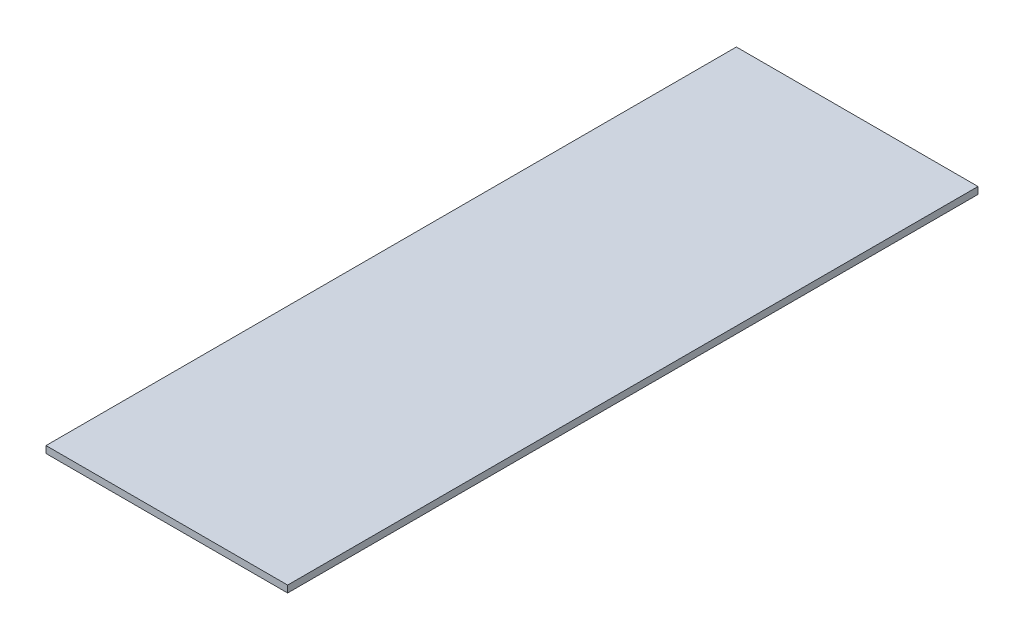
ISO-10303-21;
HEADER;
FILE_DESCRIPTION(('STEP AP214'),'2;1');
FILE_NAME('part.step','',(''),(''),'','','');
FILE_SCHEMA(('AUTOMOTIVE_DESIGN { 1 0 10303 214 1 1 1 1 }'));
ENDSEC;
DATA;
#1=APPLICATION_CONTEXT('core data for automotive mechanical design processes');
#2=APPLICATION_PROTOCOL_DEFINITION('international standard','automotive_design',2000,#1);
#3=PRODUCT_CONTEXT('',#1,'mechanical');
#4=PRODUCT('Part','Part','',(#3));
#5=PRODUCT_RELATED_PRODUCT_CATEGORY('part','',(#4));
#6=PRODUCT_DEFINITION_FORMATION('','',#4);
#7=PRODUCT_DEFINITION_CONTEXT('part definition',#1,'design');
#8=PRODUCT_DEFINITION('design','',#6,#7);
#9=PRODUCT_DEFINITION_SHAPE('','',#8);
#10=(LENGTH_UNIT() NAMED_UNIT(*) SI_UNIT(.MILLI.,.METRE.));
#11=(NAMED_UNIT(*) PLANE_ANGLE_UNIT() SI_UNIT($,.RADIAN.));
#12=(NAMED_UNIT(*) SI_UNIT($,.STERADIAN.) SOLID_ANGLE_UNIT());
#13=UNCERTAINTY_MEASURE_WITH_UNIT(LENGTH_MEASURE(1.E-05),#10,'distance_accuracy_value','');
#14=(GEOMETRIC_REPRESENTATION_CONTEXT(3) GLOBAL_UNCERTAINTY_ASSIGNED_CONTEXT((#13)) GLOBAL_UNIT_ASSIGNED_CONTEXT((#10,
#11,#12)) REPRESENTATION_CONTEXT('',''));
#15=CARTESIAN_POINT('',(0.,0.,0.));
#16=DIRECTION('',(0.,0.,1.));
#17=DIRECTION('',(1.,0.,0.));
#18=AXIS2_PLACEMENT_3D('',#15,#16,#17);
#19=CARTESIAN_POINT('',(-193.288590604027,2.,-91.9463087248322));
#20=DIRECTION('',(1.,0.,0.));
#21=DIRECTION('',(0.,0.,-1.));
#22=AXIS2_PLACEMENT_3D('',#19,#20,#21);
#23=PLANE('',#22);
#24=DIRECTION('',(0.,0.,1.));
#25=VECTOR('',#24,1.);
#26=CARTESIAN_POINT('',(-193.288590604027,0.,-91.9463087248322));
#27=LINE('',#26,#25);
#28=CARTESIAN_POINT('',(-193.288590604027,0.,-91.9463087248322));
#29=VERTEX_POINT('',#28);
#30=CARTESIAN_POINT('',(-193.288590604027,0.,108.053691275168));
#31=VERTEX_POINT('',#30);
#32=EDGE_CURVE('E105',#29,#31,#27,.T.);
#33=ORIENTED_EDGE('',*,*,#32,.T.);
#34=DIRECTION('',(0.,-1.,0.));
#35=VECTOR('',#34,1.);
#36=CARTESIAN_POINT('',(-193.288590604027,2.,108.053691275168));
#37=LINE('',#36,#35);
#38=CARTESIAN_POINT('',(-193.288590604027,2.,108.053691275168));
#39=VERTEX_POINT('',#38);
#40=EDGE_CURVE('E11',#39,#31,#37,.T.);
#41=ORIENTED_EDGE('',*,*,#40,.F.);
#42=DIRECTION('',(0.,0.,1.));
#43=VECTOR('',#42,1.);
#44=CARTESIAN_POINT('',(-193.288590604027,2.,-91.9463087248322));
#45=LINE('',#44,#43);
#46=CARTESIAN_POINT('',(-193.288590604027,2.,-91.9463087248322));
#47=VERTEX_POINT('',#46);
#48=EDGE_CURVE('E89',#47,#39,#45,.T.);
#49=ORIENTED_EDGE('',*,*,#48,.F.);
#50=DIRECTION('',(0.,-1.,0.));
#51=VECTOR('',#50,1.);
#52=CARTESIAN_POINT('',(-193.288590604027,2.,-91.9463087248322));
#53=LINE('',#52,#51);
#54=EDGE_CURVE('E101',#47,#29,#53,.T.);
#55=ORIENTED_EDGE('',*,*,#54,.T.);
#56=EDGE_LOOP('',(#33,#41,#49,#55));
#57=FACE_BOUND('',#56,.T.);
#58=ADVANCED_FACE('F37',(#57),#23,.F.);
#59=CARTESIAN_POINT('',(-193.288590604027,2.,108.053691275168));
#60=DIRECTION('',(0.,0.,-1.));
#61=DIRECTION('',(-1.,0.,0.));
#62=AXIS2_PLACEMENT_3D('',#59,#60,#61);
#63=PLANE('',#62);
#64=DIRECTION('',(1.,0.,0.));
#65=VECTOR('',#64,1.);
#66=CARTESIAN_POINT('',(-193.288590604027,0.,108.053691275168));
#67=LINE('',#66,#65);
#68=CARTESIAN_POINT('',(-123.288590604027,0.,108.053691275168));
#69=VERTEX_POINT('',#68);
#70=EDGE_CURVE('E94',#31,#69,#67,.T.);
#71=ORIENTED_EDGE('',*,*,#70,.T.);
#72=DIRECTION('',(0.,-1.,0.));
#73=VECTOR('',#72,1.);
#74=CARTESIAN_POINT('',(-123.288590604027,2.,108.053691275168));
#75=LINE('',#74,#73);
#76=CARTESIAN_POINT('',(-123.288590604027,2.,108.053691275168));
#77=VERTEX_POINT('',#76);
#78=EDGE_CURVE('E46',#77,#69,#75,.T.);
#79=ORIENTED_EDGE('',*,*,#78,.F.);
#80=DIRECTION('',(1.,0.,0.));
#81=VECTOR('',#80,1.);
#82=CARTESIAN_POINT('',(-193.288590604027,2.,108.053691275168));
#83=LINE('',#82,#81);
#84=EDGE_CURVE('E84',#39,#77,#83,.T.);
#85=ORIENTED_EDGE('',*,*,#84,.F.);
#86=ORIENTED_EDGE('',*,*,#40,.T.);
#87=EDGE_LOOP('',(#71,#79,#85,#86));
#88=FACE_BOUND('',#87,.T.);
#89=ADVANCED_FACE('F93',(#88),#63,.F.);
#90=CARTESIAN_POINT('',(-123.288590604027,2.,-91.9463087248322));
#91=DIRECTION('',(-1.,0.,0.));
#92=DIRECTION('',(0.,0.,1.));
#93=AXIS2_PLACEMENT_3D('',#90,#91,#92);
#94=PLANE('',#93);
#95=DIRECTION('',(0.,0.,-1.));
#96=VECTOR('',#95,1.);
#97=CARTESIAN_POINT('',(-123.288590604027,0.,-91.9463087248322));
#98=LINE('',#97,#96);
#99=CARTESIAN_POINT('',(-123.288590604027,0.,-91.9463087248322));
#100=VERTEX_POINT('',#99);
#101=EDGE_CURVE('E71',#69,#100,#98,.T.);
#102=ORIENTED_EDGE('',*,*,#101,.T.);
#103=DIRECTION('',(0.,-1.,0.));
#104=VECTOR('',#103,1.);
#105=CARTESIAN_POINT('',(-123.288590604027,2.,-91.9463087248322));
#106=LINE('',#105,#104);
#107=CARTESIAN_POINT('',(-123.288590604027,2.,-91.9463087248322));
#108=VERTEX_POINT('',#107);
#109=EDGE_CURVE('E96',#108,#100,#106,.T.);
#110=ORIENTED_EDGE('',*,*,#109,.F.);
#111=DIRECTION('',(0.,0.,-1.));
#112=VECTOR('',#111,1.);
#113=CARTESIAN_POINT('',(-123.288590604027,2.,-91.9463087248322));
#114=LINE('',#113,#112);
#115=EDGE_CURVE('E87',#77,#108,#114,.T.);
#116=ORIENTED_EDGE('',*,*,#115,.F.);
#117=ORIENTED_EDGE('',*,*,#78,.T.);
#118=EDGE_LOOP('',(#102,#110,#116,#117));
#119=FACE_BOUND('',#118,.T.);
#120=ADVANCED_FACE('F97',(#119),#94,.F.);
#121=CARTESIAN_POINT('',(-193.288590604027,2.,-91.9463087248322));
#122=DIRECTION('',(0.,0.,1.));
#123=DIRECTION('',(1.,0.,0.));
#124=AXIS2_PLACEMENT_3D('',#121,#122,#123);
#125=PLANE('',#124);
#126=DIRECTION('',(-1.,0.,0.));
#127=VECTOR('',#126,1.);
#128=CARTESIAN_POINT('',(-193.288590604027,0.,-91.9463087248322));
#129=LINE('',#128,#127);
#130=EDGE_CURVE('E77',#100,#29,#129,.T.);
#131=ORIENTED_EDGE('',*,*,#130,.T.);
#132=ORIENTED_EDGE('',*,*,#54,.F.);
#133=DIRECTION('',(-1.,0.,0.));
#134=VECTOR('',#133,1.);
#135=CARTESIAN_POINT('',(-193.288590604027,2.,-91.9463087248322));
#136=LINE('',#135,#134);
#137=EDGE_CURVE('E54',#108,#47,#136,.T.);
#138=ORIENTED_EDGE('',*,*,#137,.F.);
#139=ORIENTED_EDGE('',*,*,#109,.T.);
#140=EDGE_LOOP('',(#131,#132,#138,#139));
#141=FACE_BOUND('',#140,.T.);
#142=ADVANCED_FACE('F118',(#141),#125,.F.);
#143=CARTESIAN_POINT('',(0.,2.,0.));
#144=DIRECTION('',(0.,1.,0.));
#145=DIRECTION('',(0.,0.,1.));
#146=AXIS2_PLACEMENT_3D('',#143,#144,#145);
#147=PLANE('',#146);
#148=ORIENTED_EDGE('',*,*,#48,.T.);
#149=ORIENTED_EDGE('',*,*,#84,.T.);
#150=ORIENTED_EDGE('',*,*,#115,.T.);
#151=ORIENTED_EDGE('',*,*,#137,.T.);
#152=EDGE_LOOP('',(#148,#149,#150,#151));
#153=FACE_BOUND('',#152,.T.);
#154=ADVANCED_FACE('F85',(#153),#147,.T.);
#155=CARTESIAN_POINT('',(0.,0.,0.));
#156=DIRECTION('',(0.,1.,0.));
#157=DIRECTION('',(0.,0.,1.));
#158=AXIS2_PLACEMENT_3D('',#155,#156,#157);
#159=PLANE('',#158);
#160=ORIENTED_EDGE('',*,*,#32,.F.);
#161=ORIENTED_EDGE('',*,*,#130,.F.);
#162=ORIENTED_EDGE('',*,*,#101,.F.);
#163=ORIENTED_EDGE('',*,*,#70,.F.);
#164=EDGE_LOOP('',(#160,#161,#162,#163));
#165=FACE_BOUND('',#164,.T.);
#166=ADVANCED_FACE('F121',(#165),#159,.F.);
#167=CLOSED_SHELL('',(#58,#89,#120,#142,#154,#166));
#168=MANIFOLD_SOLID_BREP('B2',#167);
#169=ADVANCED_BREP_SHAPE_REPRESENTATION('',(#18,#168),#14);
#170=SHAPE_DEFINITION_REPRESENTATION(#9,#169);
ENDSEC;
END-ISO-10303-21;
